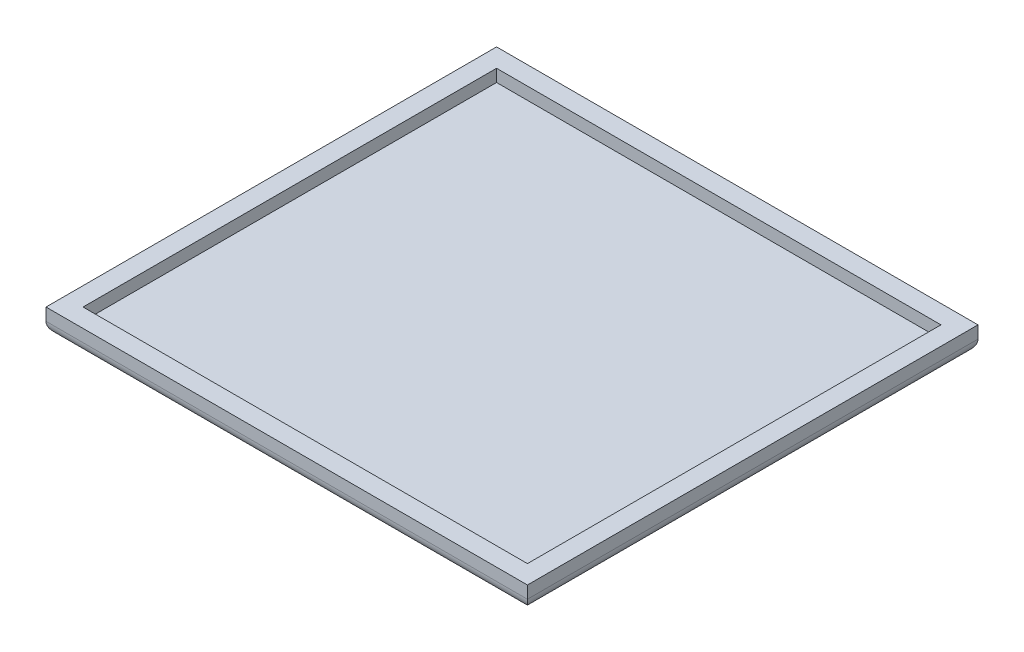
ISO-10303-21;
HEADER;
FILE_DESCRIPTION(('STEP AP214'),'2;1');
FILE_NAME('part.step','',(''),(''),'','','');
FILE_SCHEMA(('AUTOMOTIVE_DESIGN { 1 0 10303 214 1 1 1 1 }'));
ENDSEC;
DATA;
#1=APPLICATION_CONTEXT('core data for automotive mechanical design processes');
#2=APPLICATION_PROTOCOL_DEFINITION('international standard','automotive_design',2000,#1);
#3=PRODUCT_CONTEXT('',#1,'mechanical');
#4=PRODUCT('Part','Part','',(#3));
#5=PRODUCT_RELATED_PRODUCT_CATEGORY('part','',(#4));
#6=PRODUCT_DEFINITION_FORMATION('','',#4);
#7=PRODUCT_DEFINITION_CONTEXT('part definition',#1,'design');
#8=PRODUCT_DEFINITION('design','',#6,#7);
#9=PRODUCT_DEFINITION_SHAPE('','',#8);
#10=(LENGTH_UNIT() NAMED_UNIT(*) SI_UNIT(.MILLI.,.METRE.));
#11=(NAMED_UNIT(*) PLANE_ANGLE_UNIT() SI_UNIT($,.RADIAN.));
#12=(NAMED_UNIT(*) SI_UNIT($,.STERADIAN.) SOLID_ANGLE_UNIT());
#13=UNCERTAINTY_MEASURE_WITH_UNIT(LENGTH_MEASURE(1.E-05),#10,'distance_accuracy_value','');
#14=(GEOMETRIC_REPRESENTATION_CONTEXT(3) GLOBAL_UNCERTAINTY_ASSIGNED_CONTEXT((#13)) GLOBAL_UNIT_ASSIGNED_CONTEXT((#10,
#11,#12)) REPRESENTATION_CONTEXT('',''));
#15=CARTESIAN_POINT('',(0.,0.,0.));
#16=DIRECTION('',(0.,0.,1.));
#17=DIRECTION('',(1.,0.,0.));
#18=AXIS2_PLACEMENT_3D('',#15,#16,#17);
#19=CARTESIAN_POINT('',(0.,4.,0.));
#20=DIRECTION('',(1.,0.,0.));
#21=DIRECTION('',(0.,0.,-1.));
#22=AXIS2_PLACEMENT_3D('',#19,#20,#21);
#23=PLANE('',#22);
#24=DIRECTION('',(0.,-1.,0.));
#25=VECTOR('',#24,1.);
#26=CARTESIAN_POINT('',(0.,4.,-73.));
#27=LINE('',#26,#25);
#28=CARTESIAN_POINT('',(0.,4.,-73.));
#29=VERTEX_POINT('',#28);
#30=CARTESIAN_POINT('',(0.,2.,-73.));
#31=VERTEX_POINT('',#30);
#32=EDGE_CURVE('E191',#29,#31,#27,.T.);
#33=ORIENTED_EDGE('',*,*,#32,.T.);
#34=DIRECTION('',(0.,0.,1.));
#35=VECTOR('',#34,1.);
#36=CARTESIAN_POINT('',(0.,2.,0.));
#37=LINE('',#36,#35);
#38=CARTESIAN_POINT('',(0.,2.,0.));
#39=VERTEX_POINT('',#38);
#40=EDGE_CURVE('E204',#31,#39,#37,.T.);
#41=ORIENTED_EDGE('',*,*,#40,.T.);
#42=DIRECTION('',(0.,-1.,0.));
#43=VECTOR('',#42,1.);
#44=CARTESIAN_POINT('',(0.,4.,0.));
#45=LINE('',#44,#43);
#46=CARTESIAN_POINT('',(0.,4.,0.));
#47=VERTEX_POINT('',#46);
#48=EDGE_CURVE('E201',#47,#39,#45,.T.);
#49=ORIENTED_EDGE('',*,*,#48,.F.);
#50=DIRECTION('',(0.,0.,1.));
#51=VECTOR('',#50,1.);
#52=CARTESIAN_POINT('',(0.,4.,0.));
#53=LINE('',#52,#51);
#54=EDGE_CURVE('E173',#29,#47,#53,.T.);
#55=ORIENTED_EDGE('',*,*,#54,.F.);
#56=EDGE_LOOP('',(#33,#41,#49,#55));
#57=FACE_BOUND('',#56,.T.);
#58=ADVANCED_FACE('F44',(#57),#23,.F.);
#59=CARTESIAN_POINT('',(0.,4.,0.));
#60=DIRECTION('',(0.,0.,-1.));
#61=DIRECTION('',(-1.,0.,0.));
#62=AXIS2_PLACEMENT_3D('',#59,#60,#61);
#63=PLANE('',#62);
#64=ORIENTED_EDGE('',*,*,#48,.T.);
#65=DIRECTION('',(1.,0.,0.));
#66=VECTOR('',#65,1.);
#67=CARTESIAN_POINT('',(78.,2.,0.));
#68=LINE('',#67,#66);
#69=CARTESIAN_POINT('',(78.,2.,0.));
#70=VERTEX_POINT('',#69);
#71=EDGE_CURVE('E69',#39,#70,#68,.T.);
#72=ORIENTED_EDGE('',*,*,#71,.T.);
#73=DIRECTION('',(0.,-1.,0.));
#74=VECTOR('',#73,1.);
#75=CARTESIAN_POINT('',(78.,4.,0.));
#76=LINE('',#75,#74);
#77=CARTESIAN_POINT('',(78.,4.,0.));
#78=VERTEX_POINT('',#77);
#79=EDGE_CURVE('E198',#78,#70,#76,.T.);
#80=ORIENTED_EDGE('',*,*,#79,.F.);
#81=DIRECTION('',(1.,0.,0.));
#82=VECTOR('',#81,1.);
#83=CARTESIAN_POINT('',(0.,4.,0.));
#84=LINE('',#83,#82);
#85=EDGE_CURVE('E182',#47,#78,#84,.T.);
#86=ORIENTED_EDGE('',*,*,#85,.F.);
#87=EDGE_LOOP('',(#64,#72,#80,#86));
#88=FACE_BOUND('',#87,.T.);
#89=ADVANCED_FACE('F258',(#88),#63,.F.);
#90=CARTESIAN_POINT('',(78.,4.,0.));
#91=DIRECTION('',(-1.,0.,0.));
#92=DIRECTION('',(0.,0.,1.));
#93=AXIS2_PLACEMENT_3D('',#90,#91,#92);
#94=PLANE('',#93);
#95=ORIENTED_EDGE('',*,*,#79,.T.);
#96=DIRECTION('',(0.,0.,-1.));
#97=VECTOR('',#96,1.);
#98=CARTESIAN_POINT('',(78.,2.,-73.));
#99=LINE('',#98,#97);
#100=CARTESIAN_POINT('',(78.,2.,-73.));
#101=VERTEX_POINT('',#100);
#102=EDGE_CURVE('E54',#70,#101,#99,.T.);
#103=ORIENTED_EDGE('',*,*,#102,.T.);
#104=DIRECTION('',(0.,-1.,0.));
#105=VECTOR('',#104,1.);
#106=CARTESIAN_POINT('',(78.,4.,-73.));
#107=LINE('',#106,#105);
#108=CARTESIAN_POINT('',(78.,4.,-73.));
#109=VERTEX_POINT('',#108);
#110=EDGE_CURVE('E195',#109,#101,#107,.T.);
#111=ORIENTED_EDGE('',*,*,#110,.F.);
#112=DIRECTION('',(0.,0.,-1.));
#113=VECTOR('',#112,1.);
#114=CARTESIAN_POINT('',(78.,4.,0.));
#115=LINE('',#114,#113);
#116=EDGE_CURVE('E185',#78,#109,#115,.T.);
#117=ORIENTED_EDGE('',*,*,#116,.F.);
#118=EDGE_LOOP('',(#95,#103,#111,#117));
#119=FACE_BOUND('',#118,.T.);
#120=ADVANCED_FACE('F265',(#119),#94,.F.);
#121=CARTESIAN_POINT('',(0.,4.,-73.));
#122=DIRECTION('',(0.,0.,1.));
#123=DIRECTION('',(1.,0.,0.));
#124=AXIS2_PLACEMENT_3D('',#121,#122,#123);
#125=PLANE('',#124);
#126=ORIENTED_EDGE('',*,*,#110,.T.);
#127=DIRECTION('',(-1.,0.,0.));
#128=VECTOR('',#127,1.);
#129=CARTESIAN_POINT('',(0.,2.,-73.));
#130=LINE('',#129,#128);
#131=EDGE_CURVE('E11',#101,#31,#130,.T.);
#132=ORIENTED_EDGE('',*,*,#131,.T.);
#133=ORIENTED_EDGE('',*,*,#32,.F.);
#134=DIRECTION('',(-1.,0.,0.));
#135=VECTOR('',#134,1.);
#136=CARTESIAN_POINT('',(0.,4.,-73.));
#137=LINE('',#136,#135);
#138=EDGE_CURVE('E188',#109,#29,#137,.T.);
#139=ORIENTED_EDGE('',*,*,#138,.F.);
#140=EDGE_LOOP('',(#126,#132,#133,#139));
#141=FACE_BOUND('',#140,.T.);
#142=ADVANCED_FACE('F264',(#141),#125,.F.);
#143=CARTESIAN_POINT('',(0.,4.,0.));
#144=DIRECTION('',(0.,-1.,0.));
#145=DIRECTION('',(0.,0.,-1.));
#146=AXIS2_PLACEMENT_3D('',#143,#144,#145);
#147=PLANE('',#146);
#148=DIRECTION('',(1.,0.,0.));
#149=VECTOR('',#148,1.);
#150=CARTESIAN_POINT('',(3.00000000000001,4.,-3.));
#151=LINE('',#150,#149);
#152=CARTESIAN_POINT('',(3.00000000000001,4.,-3.));
#153=VERTEX_POINT('',#152);
#154=CARTESIAN_POINT('',(75.,4.,-3.));
#155=VERTEX_POINT('',#154);
#156=EDGE_CURVE('E164',#153,#155,#151,.T.);
#157=ORIENTED_EDGE('',*,*,#156,.F.);
#158=DIRECTION('',(0.,0.,1.));
#159=VECTOR('',#158,1.);
#160=CARTESIAN_POINT('',(3.,4.,-70.));
#161=LINE('',#160,#159);
#162=CARTESIAN_POINT('',(3.,4.,-70.));
#163=VERTEX_POINT('',#162);
#164=EDGE_CURVE('E131',#163,#153,#161,.T.);
#165=ORIENTED_EDGE('',*,*,#164,.F.);
#166=DIRECTION('',(1.,0.,0.));
#167=VECTOR('',#166,1.);
#168=CARTESIAN_POINT('',(3.,4.,-70.));
#169=LINE('',#168,#167);
#170=CARTESIAN_POINT('',(75.,4.,-70.));
#171=VERTEX_POINT('',#170);
#172=EDGE_CURVE('E151',#163,#171,#169,.T.);
#173=ORIENTED_EDGE('',*,*,#172,.T.);
#174=DIRECTION('',(0.,0.,1.));
#175=VECTOR('',#174,1.);
#176=CARTESIAN_POINT('',(75.,4.,-70.));
#177=LINE('',#176,#175);
#178=EDGE_CURVE('E155',#171,#155,#177,.T.);
#179=ORIENTED_EDGE('',*,*,#178,.T.);
#180=EDGE_LOOP('',(#157,#165,#173,#179));
#181=FACE_BOUND('',#180,.T.);
#182=ORIENTED_EDGE('',*,*,#54,.T.);
#183=ORIENTED_EDGE('',*,*,#85,.T.);
#184=ORIENTED_EDGE('',*,*,#116,.T.);
#185=ORIENTED_EDGE('',*,*,#138,.T.);
#186=EDGE_LOOP('',(#182,#183,#184,#185));
#187=FACE_BOUND('',#186,.T.);
#188=ADVANCED_FACE('F261',(#181,#187),#147,.F.);
#189=CARTESIAN_POINT('',(0.,0.,0.));
#190=DIRECTION('',(0.,-1.,0.));
#191=DIRECTION('',(0.,0.,-1.));
#192=AXIS2_PLACEMENT_3D('',#189,#190,#191);
#193=PLANE('',#192);
#194=DIRECTION('',(1.,0.,0.));
#195=VECTOR('',#194,1.);
#196=CARTESIAN_POINT('',(0.,0.,-2.));
#197=LINE('',#196,#195);
#198=CARTESIAN_POINT('',(76.,0.,-2.));
#199=VERTEX_POINT('',#198);
#200=CARTESIAN_POINT('',(2.,0.,-2.));
#201=VERTEX_POINT('',#200);
#202=EDGE_CURVE('E214',#199,#201,#197,.F.);
#203=ORIENTED_EDGE('',*,*,#202,.T.);
#204=DIRECTION('',(0.,0.,1.));
#205=VECTOR('',#204,1.);
#206=CARTESIAN_POINT('',(2.,0.,-73.));
#207=LINE('',#206,#205);
#208=CARTESIAN_POINT('',(2.,0.,-71.));
#209=VERTEX_POINT('',#208);
#210=EDGE_CURVE('E217',#201,#209,#207,.F.);
#211=ORIENTED_EDGE('',*,*,#210,.T.);
#212=DIRECTION('',(-1.,0.,0.));
#213=VECTOR('',#212,1.);
#214=CARTESIAN_POINT('',(78.,0.,-71.));
#215=LINE('',#214,#213);
#216=CARTESIAN_POINT('',(76.,0.,-71.));
#217=VERTEX_POINT('',#216);
#218=EDGE_CURVE('E208',#209,#217,#215,.F.);
#219=ORIENTED_EDGE('',*,*,#218,.T.);
#220=DIRECTION('',(0.,0.,-1.));
#221=VECTOR('',#220,1.);
#222=CARTESIAN_POINT('',(76.,0.,0.));
#223=LINE('',#222,#221);
#224=EDGE_CURVE('E211',#217,#199,#223,.F.);
#225=ORIENTED_EDGE('',*,*,#224,.T.);
#226=EDGE_LOOP('',(#203,#211,#219,#225));
#227=FACE_BOUND('',#226,.T.);
#228=ADVANCED_FACE('F247',(#227),#193,.T.);
#229=CARTESIAN_POINT('',(3.,2.,-70.));
#230=DIRECTION('',(-1.,0.,0.));
#231=DIRECTION('',(0.,0.,1.));
#232=AXIS2_PLACEMENT_3D('',#229,#230,#231);
#233=PLANE('',#232);
#234=ORIENTED_EDGE('',*,*,#164,.T.);
#235=DIRECTION('',(0.,1.,0.));
#236=VECTOR('',#235,1.);
#237=CARTESIAN_POINT('',(3.00000000000001,2.,-3.));
#238=LINE('',#237,#236);
#239=CARTESIAN_POINT('',(3.00000000000001,2.,-3.));
#240=VERTEX_POINT('',#239);
#241=EDGE_CURVE('E125',#240,#153,#238,.T.);
#242=ORIENTED_EDGE('',*,*,#241,.F.);
#243=DIRECTION('',(0.,0.,1.));
#244=VECTOR('',#243,1.);
#245=CARTESIAN_POINT('',(3.,2.,-70.));
#246=LINE('',#245,#244);
#247=CARTESIAN_POINT('',(3.,2.,-70.));
#248=VERTEX_POINT('',#247);
#249=EDGE_CURVE('E129',#248,#240,#246,.T.);
#250=ORIENTED_EDGE('',*,*,#249,.F.);
#251=DIRECTION('',(0.,1.,0.));
#252=VECTOR('',#251,1.);
#253=CARTESIAN_POINT('',(3.,2.,-70.));
#254=LINE('',#253,#252);
#255=EDGE_CURVE('E170',#248,#163,#254,.T.);
#256=ORIENTED_EDGE('',*,*,#255,.T.);
#257=EDGE_LOOP('',(#234,#242,#250,#256));
#258=FACE_BOUND('',#257,.T.);
#259=ADVANCED_FACE('F127',(#258),#233,.F.);
#260=CARTESIAN_POINT('',(3.,2.,-70.));
#261=DIRECTION('',(0.,0.,1.));
#262=DIRECTION('',(1.,0.,0.));
#263=AXIS2_PLACEMENT_3D('',#260,#261,#262);
#264=PLANE('',#263);
#265=ORIENTED_EDGE('',*,*,#172,.F.);
#266=ORIENTED_EDGE('',*,*,#255,.F.);
#267=DIRECTION('',(1.,0.,0.));
#268=VECTOR('',#267,1.);
#269=CARTESIAN_POINT('',(3.,2.,-70.));
#270=LINE('',#269,#268);
#271=CARTESIAN_POINT('',(75.,2.,-70.));
#272=VERTEX_POINT('',#271);
#273=EDGE_CURVE('E137',#248,#272,#270,.T.);
#274=ORIENTED_EDGE('',*,*,#273,.T.);
#275=DIRECTION('',(0.,1.,0.));
#276=VECTOR('',#275,1.);
#277=CARTESIAN_POINT('',(75.,2.,-70.));
#278=LINE('',#277,#276);
#279=EDGE_CURVE('E174',#272,#171,#278,.T.);
#280=ORIENTED_EDGE('',*,*,#279,.T.);
#281=EDGE_LOOP('',(#265,#266,#274,#280));
#282=FACE_BOUND('',#281,.T.);
#283=ADVANCED_FACE('F297',(#282),#264,.T.);
#284=CARTESIAN_POINT('',(75.,2.,-70.));
#285=DIRECTION('',(-1.,0.,0.));
#286=DIRECTION('',(0.,0.,1.));
#287=AXIS2_PLACEMENT_3D('',#284,#285,#286);
#288=PLANE('',#287);
#289=ORIENTED_EDGE('',*,*,#178,.F.);
#290=ORIENTED_EDGE('',*,*,#279,.F.);
#291=DIRECTION('',(0.,0.,1.));
#292=VECTOR('',#291,1.);
#293=CARTESIAN_POINT('',(75.,2.,-70.));
#294=LINE('',#293,#292);
#295=CARTESIAN_POINT('',(75.,2.,-3.));
#296=VERTEX_POINT('',#295);
#297=EDGE_CURVE('E146',#272,#296,#294,.T.);
#298=ORIENTED_EDGE('',*,*,#297,.T.);
#299=DIRECTION('',(0.,1.,0.));
#300=VECTOR('',#299,1.);
#301=CARTESIAN_POINT('',(75.,2.,-3.));
#302=LINE('',#301,#300);
#303=EDGE_CURVE('E136',#296,#155,#302,.T.);
#304=ORIENTED_EDGE('',*,*,#303,.T.);
#305=EDGE_LOOP('',(#289,#290,#298,#304));
#306=FACE_BOUND('',#305,.T.);
#307=ADVANCED_FACE('F294',(#306),#288,.T.);
#308=CARTESIAN_POINT('',(3.00000000000001,2.,-3.));
#309=DIRECTION('',(0.,0.,1.));
#310=DIRECTION('',(1.,0.,0.));
#311=AXIS2_PLACEMENT_3D('',#308,#309,#310);
#312=PLANE('',#311);
#313=ORIENTED_EDGE('',*,*,#156,.T.);
#314=ORIENTED_EDGE('',*,*,#303,.F.);
#315=DIRECTION('',(1.,0.,0.));
#316=VECTOR('',#315,1.);
#317=CARTESIAN_POINT('',(3.00000000000001,2.,-3.));
#318=LINE('',#317,#316);
#319=EDGE_CURVE('E141',#240,#296,#318,.T.);
#320=ORIENTED_EDGE('',*,*,#319,.F.);
#321=ORIENTED_EDGE('',*,*,#241,.T.);
#322=EDGE_LOOP('',(#313,#314,#320,#321));
#323=FACE_BOUND('',#322,.T.);
#324=ADVANCED_FACE('F142',(#323),#312,.F.);
#325=CARTESIAN_POINT('',(0.,2.,0.));
#326=DIRECTION('',(0.,1.,0.));
#327=DIRECTION('',(0.,0.,1.));
#328=AXIS2_PLACEMENT_3D('',#325,#326,#327);
#329=PLANE('',#328);
#330=ORIENTED_EDGE('',*,*,#249,.T.);
#331=ORIENTED_EDGE('',*,*,#319,.T.);
#332=ORIENTED_EDGE('',*,*,#297,.F.);
#333=ORIENTED_EDGE('',*,*,#273,.F.);
#334=EDGE_LOOP('',(#330,#331,#332,#333));
#335=FACE_BOUND('',#334,.T.);
#336=ADVANCED_FACE('F149',(#335),#329,.T.);
#337=CARTESIAN_POINT('',(76.,2.,0.));
#338=DIRECTION('',(0.,0.,1.));
#339=DIRECTION('',(1.,0.,0.));
#340=AXIS2_PLACEMENT_3D('',#337,#338,#339);
#341=CYLINDRICAL_SURFACE('',#340,2.);
#342=CARTESIAN_POINT('',(76.,2.,-2.));
#343=DIRECTION('',(-0.707106781186547,0.,0.707106781186547));
#344=DIRECTION('',(0.707106781186547,0.,0.707106781186547));
#345=AXIS2_PLACEMENT_3D('',#342,#343,#344);
#346=ELLIPSE('',#345,2.82842712474619,2.);
#347=EDGE_CURVE('E230',#199,#70,#346,.T.);
#348=ORIENTED_EDGE('',*,*,#347,.F.);
#349=ORIENTED_EDGE('',*,*,#224,.F.);
#350=CARTESIAN_POINT('',(76.,2.,-71.));
#351=DIRECTION('',(0.707106781186547,0.,0.707106781186547));
#352=DIRECTION('',(0.707106781186547,0.,-0.707106781186547));
#353=AXIS2_PLACEMENT_3D('',#350,#351,#352);
#354=ELLIPSE('',#353,2.82842712474619,2.);
#355=EDGE_CURVE('E48',#101,#217,#354,.F.);
#356=ORIENTED_EDGE('',*,*,#355,.F.);
#357=ORIENTED_EDGE('',*,*,#102,.F.);
#358=EDGE_LOOP('',(#348,#349,#356,#357));
#359=FACE_BOUND('',#358,.T.);
#360=ADVANCED_FACE('F46',(#359),#341,.T.);
#361=CARTESIAN_POINT('',(0.,2.,-71.));
#362=DIRECTION('',(1.,0.,0.));
#363=DIRECTION('',(0.,0.,-1.));
#364=AXIS2_PLACEMENT_3D('',#361,#362,#363);
#365=CYLINDRICAL_SURFACE('',#364,2.);
#366=ORIENTED_EDGE('',*,*,#355,.T.);
#367=ORIENTED_EDGE('',*,*,#218,.F.);
#368=CARTESIAN_POINT('',(2.,2.,-71.));
#369=DIRECTION('',(0.707106781186547,0.,-0.707106781186547));
#370=DIRECTION('',(0.707106781186547,0.,0.707106781186547));
#371=AXIS2_PLACEMENT_3D('',#368,#369,#370);
#372=ELLIPSE('',#371,2.82842712474619,2.);
#373=EDGE_CURVE('E228',#31,#209,#372,.F.);
#374=ORIENTED_EDGE('',*,*,#373,.F.);
#375=ORIENTED_EDGE('',*,*,#131,.F.);
#376=EDGE_LOOP('',(#366,#367,#374,#375));
#377=FACE_BOUND('',#376,.T.);
#378=ADVANCED_FACE('F242',(#377),#365,.T.);
#379=CARTESIAN_POINT('',(0.,2.,-2.));
#380=DIRECTION('',(-1.,0.,0.));
#381=DIRECTION('',(0.,0.,1.));
#382=AXIS2_PLACEMENT_3D('',#379,#380,#381);
#383=CYLINDRICAL_SURFACE('',#382,2.);
#384=ORIENTED_EDGE('',*,*,#347,.T.);
#385=ORIENTED_EDGE('',*,*,#71,.F.);
#386=CARTESIAN_POINT('',(2.,2.,-2.));
#387=DIRECTION('',(-0.707106781186547,0.,-0.707106781186547));
#388=DIRECTION('',(-0.707106781186547,0.,0.707106781186547));
#389=AXIS2_PLACEMENT_3D('',#386,#387,#388);
#390=ELLIPSE('',#389,2.82842712474619,2.);
#391=EDGE_CURVE('E225',#201,#39,#390,.T.);
#392=ORIENTED_EDGE('',*,*,#391,.F.);
#393=ORIENTED_EDGE('',*,*,#202,.F.);
#394=EDGE_LOOP('',(#384,#385,#392,#393));
#395=FACE_BOUND('',#394,.T.);
#396=ADVANCED_FACE('F253',(#395),#383,.T.);
#397=CARTESIAN_POINT('',(2.,2.,0.));
#398=DIRECTION('',(0.,0.,-1.));
#399=DIRECTION('',(-1.,0.,0.));
#400=AXIS2_PLACEMENT_3D('',#397,#398,#399);
#401=CYLINDRICAL_SURFACE('',#400,2.);
#402=ORIENTED_EDGE('',*,*,#373,.T.);
#403=ORIENTED_EDGE('',*,*,#210,.F.);
#404=ORIENTED_EDGE('',*,*,#391,.T.);
#405=ORIENTED_EDGE('',*,*,#40,.F.);
#406=EDGE_LOOP('',(#402,#403,#404,#405));
#407=FACE_BOUND('',#406,.T.);
#408=ADVANCED_FACE('F251',(#407),#401,.T.);
#409=CLOSED_SHELL('',(#58,#89,#120,#142,#188,#228,#259,#283,#307,#324,#336,#360,#378,#396,#408));
#410=MANIFOLD_SOLID_BREP('B2',#409);
#411=ADVANCED_BREP_SHAPE_REPRESENTATION('',(#18,#410),#14);
#412=SHAPE_DEFINITION_REPRESENTATION(#9,#411);
ENDSEC;
END-ISO-10303-21;
